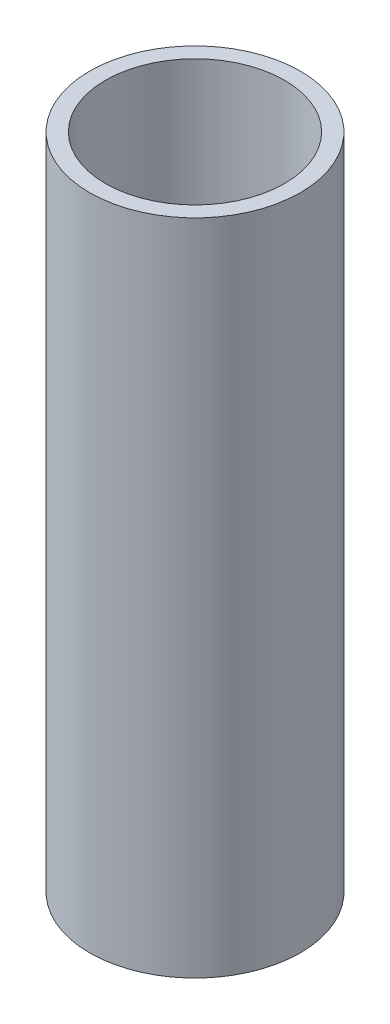
ISO-10303-21;
HEADER;
FILE_DESCRIPTION(('STEP AP214'),'2;1');
FILE_NAME('part.step','',(''),(''),'','','');
FILE_SCHEMA(('AUTOMOTIVE_DESIGN { 1 0 10303 214 1 1 1 1 }'));
ENDSEC;
DATA;
#1=APPLICATION_CONTEXT('core data for automotive mechanical design processes');
#2=APPLICATION_PROTOCOL_DEFINITION('international standard','automotive_design',2000,#1);
#3=PRODUCT_CONTEXT('',#1,'mechanical');
#4=PRODUCT('Part','Part','',(#3));
#5=PRODUCT_RELATED_PRODUCT_CATEGORY('part','',(#4));
#6=PRODUCT_DEFINITION_FORMATION('','',#4);
#7=PRODUCT_DEFINITION_CONTEXT('part definition',#1,'design');
#8=PRODUCT_DEFINITION('design','',#6,#7);
#9=PRODUCT_DEFINITION_SHAPE('','',#8);
#10=(LENGTH_UNIT() NAMED_UNIT(*) SI_UNIT(.MILLI.,.METRE.));
#11=(NAMED_UNIT(*) PLANE_ANGLE_UNIT() SI_UNIT($,.RADIAN.));
#12=(NAMED_UNIT(*) SI_UNIT($,.STERADIAN.) SOLID_ANGLE_UNIT());
#13=UNCERTAINTY_MEASURE_WITH_UNIT(LENGTH_MEASURE(1.E-05),#10,'distance_accuracy_value','');
#14=(GEOMETRIC_REPRESENTATION_CONTEXT(3) GLOBAL_UNCERTAINTY_ASSIGNED_CONTEXT((#13)) GLOBAL_UNIT_ASSIGNED_CONTEXT((#10,
#11,#12)) REPRESENTATION_CONTEXT('',''));
#15=CARTESIAN_POINT('',(0.,0.,0.));
#16=DIRECTION('',(0.,0.,1.));
#17=DIRECTION('',(1.,0.,0.));
#18=AXIS2_PLACEMENT_3D('',#15,#16,#17);
#19=CARTESIAN_POINT('',(0.,100.,0.));
#20=DIRECTION('',(0.,1.,0.));
#21=DIRECTION('',(0.,0.,1.));
#22=AXIS2_PLACEMENT_3D('',#19,#20,#21);
#23=PLANE('',#22);
#24=CARTESIAN_POINT('',(0.,100.,0.));
#25=DIRECTION('',(0.,1.,0.));
#26=DIRECTION('',(0.,0.,1.));
#27=AXIS2_PLACEMENT_3D('',#24,#25,#26);
#28=CIRCLE('',#27,16.);
#29=CARTESIAN_POINT('',(0.,100.,16.));
#30=VERTEX_POINT('',#29);
#31=EDGE_CURVE('E10',#30,#30,#28,.T.);
#32=ORIENTED_EDGE('',*,*,#31,.T.);
#33=EDGE_LOOP('',(#32));
#34=FACE_BOUND('',#33,.T.);
#35=CARTESIAN_POINT('',(0.,100.,0.));
#36=DIRECTION('',(0.,1.,0.));
#37=DIRECTION('',(0.,0.,1.));
#38=AXIS2_PLACEMENT_3D('',#35,#36,#37);
#39=CIRCLE('',#38,13.6);
#40=CARTESIAN_POINT('',(0.,100.,13.6));
#41=VERTEX_POINT('',#40);
#42=EDGE_CURVE('E48',#41,#41,#39,.T.);
#43=ORIENTED_EDGE('',*,*,#42,.F.);
#44=EDGE_LOOP('',(#43));
#45=FACE_BOUND('',#44,.T.);
#46=ADVANCED_FACE('F37',(#34,#45),#23,.T.);
#47=CARTESIAN_POINT('',(0.,0.,0.));
#48=DIRECTION('',(0.,1.,0.));
#49=DIRECTION('',(0.,0.,1.));
#50=AXIS2_PLACEMENT_3D('',#47,#48,#49);
#51=PLANE('',#50);
#52=CARTESIAN_POINT('',(0.,0.,0.));
#53=DIRECTION('',(0.,1.,0.));
#54=DIRECTION('',(0.,0.,1.));
#55=AXIS2_PLACEMENT_3D('',#52,#53,#54);
#56=CIRCLE('',#55,16.);
#57=CARTESIAN_POINT('',(0.,0.,16.));
#58=VERTEX_POINT('',#57);
#59=EDGE_CURVE('E41',#58,#58,#56,.T.);
#60=ORIENTED_EDGE('',*,*,#59,.F.);
#61=EDGE_LOOP('',(#60));
#62=FACE_BOUND('',#61,.T.);
#63=CARTESIAN_POINT('',(0.,0.,0.));
#64=DIRECTION('',(0.,1.,0.));
#65=DIRECTION('',(0.,0.,1.));
#66=AXIS2_PLACEMENT_3D('',#63,#64,#65);
#67=CIRCLE('',#66,13.6);
#68=CARTESIAN_POINT('',(0.,0.,13.6));
#69=VERTEX_POINT('',#68);
#70=EDGE_CURVE('E50',#69,#69,#67,.T.);
#71=ORIENTED_EDGE('',*,*,#70,.T.);
#72=EDGE_LOOP('',(#71));
#73=FACE_BOUND('',#72,.T.);
#74=ADVANCED_FACE('F60',(#62,#73),#51,.F.);
#75=CARTESIAN_POINT('',(0.,100.,0.));
#76=DIRECTION('',(0.,-1.,0.));
#77=DIRECTION('',(0.,0.,-1.));
#78=AXIS2_PLACEMENT_3D('',#75,#76,#77);
#79=CYLINDRICAL_SURFACE('',#78,16.);
#80=ORIENTED_EDGE('',*,*,#31,.F.);
#81=EDGE_LOOP('',(#80));
#82=FACE_BOUND('',#81,.T.);
#83=ORIENTED_EDGE('',*,*,#59,.T.);
#84=EDGE_LOOP('',(#83));
#85=FACE_BOUND('',#84,.T.);
#86=ADVANCED_FACE('F39',(#82,#85),#79,.T.);
#87=CARTESIAN_POINT('',(0.,100.,0.));
#88=DIRECTION('',(0.,-1.,0.));
#89=DIRECTION('',(0.,0.,-1.));
#90=AXIS2_PLACEMENT_3D('',#87,#88,#89);
#91=CYLINDRICAL_SURFACE('',#90,13.6);
#92=ORIENTED_EDGE('',*,*,#42,.T.);
#93=EDGE_LOOP('',(#92));
#94=FACE_BOUND('',#93,.T.);
#95=ORIENTED_EDGE('',*,*,#70,.F.);
#96=EDGE_LOOP('',(#95));
#97=FACE_BOUND('',#96,.T.);
#98=ADVANCED_FACE('F56',(#94,#97),#91,.F.);
#99=CLOSED_SHELL('',(#46,#74,#86,#98));
#100=MANIFOLD_SOLID_BREP('B2',#99);
#101=ADVANCED_BREP_SHAPE_REPRESENTATION('',(#18,#100),#14);
#102=SHAPE_DEFINITION_REPRESENTATION(#9,#101);
ENDSEC;
END-ISO-10303-21;
